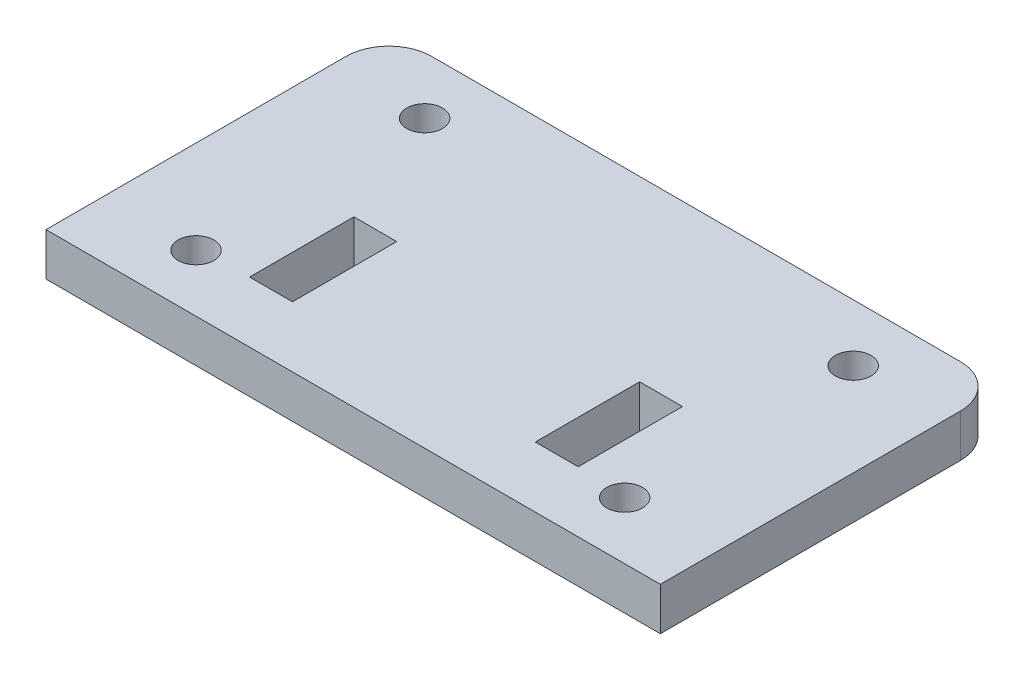
ISO-10303-21;
HEADER;
FILE_DESCRIPTION(('STEP AP214'),'2;1');
FILE_NAME('part.step','',(''),(''),'','','');
FILE_SCHEMA(('AUTOMOTIVE_DESIGN { 1 0 10303 214 1 1 1 1 }'));
ENDSEC;
DATA;
#1=APPLICATION_CONTEXT('core data for automotive mechanical design processes');
#2=APPLICATION_PROTOCOL_DEFINITION('international standard','automotive_design',2000,#1);
#3=PRODUCT_CONTEXT('',#1,'mechanical');
#4=PRODUCT('Part','Part','',(#3));
#5=PRODUCT_RELATED_PRODUCT_CATEGORY('part','',(#4));
#6=PRODUCT_DEFINITION_FORMATION('','',#4);
#7=PRODUCT_DEFINITION_CONTEXT('part definition',#1,'design');
#8=PRODUCT_DEFINITION('design','',#6,#7);
#9=PRODUCT_DEFINITION_SHAPE('','',#8);
#10=(LENGTH_UNIT() NAMED_UNIT(*) SI_UNIT(.MILLI.,.METRE.));
#11=(NAMED_UNIT(*) PLANE_ANGLE_UNIT() SI_UNIT($,.RADIAN.));
#12=(NAMED_UNIT(*) SI_UNIT($,.STERADIAN.) SOLID_ANGLE_UNIT());
#13=UNCERTAINTY_MEASURE_WITH_UNIT(LENGTH_MEASURE(1.E-05),#10,'distance_accuracy_value','');
#14=(GEOMETRIC_REPRESENTATION_CONTEXT(3) GLOBAL_UNCERTAINTY_ASSIGNED_CONTEXT((#13)) GLOBAL_UNIT_ASSIGNED_CONTEXT((#10,
#11,#12)) REPRESENTATION_CONTEXT('',''));
#15=CARTESIAN_POINT('',(0.,0.,0.));
#16=DIRECTION('',(0.,0.,1.));
#17=DIRECTION('',(1.,0.,0.));
#18=AXIS2_PLACEMENT_3D('',#15,#16,#17);
#19=CARTESIAN_POINT('',(-18.5,3.,-21.));
#20=DIRECTION('',(0.,1.,0.));
#21=DIRECTION('',(0.,0.,1.));
#22=AXIS2_PLACEMENT_3D('',#19,#20,#21);
#23=PLANE('',#22);
#24=CARTESIAN_POINT('',(15.,3.,-4.));
#25=DIRECTION('',(0.,1.,0.));
#26=DIRECTION('',(0.,0.,1.));
#27=AXIS2_PLACEMENT_3D('',#24,#25,#26);
#28=CIRCLE('',#27,1.25);
#29=CARTESIAN_POINT('',(15.,3.,-2.75));
#30=VERTEX_POINT('',#29);
#31=EDGE_CURVE('E346',#30,#30,#28,.T.);
#32=ORIENTED_EDGE('',*,*,#31,.F.);
#33=EDGE_LOOP('',(#32));
#34=FACE_BOUND('',#33,.T.);
#35=CARTESIAN_POINT('',(-15.,3.,-20.));
#36=DIRECTION('',(0.,1.,0.));
#37=DIRECTION('',(0.,0.,1.));
#38=AXIS2_PLACEMENT_3D('',#35,#36,#37);
#39=CIRCLE('',#38,1.25);
#40=CARTESIAN_POINT('',(-15.,3.,-18.75));
#41=VERTEX_POINT('',#40);
#42=EDGE_CURVE('E163',#41,#41,#39,.T.);
#43=ORIENTED_EDGE('',*,*,#42,.F.);
#44=EDGE_LOOP('',(#43));
#45=FACE_BOUND('',#44,.T.);
#46=DIRECTION('',(0.,0.,-1.));
#47=VECTOR('',#46,1.);
#48=CARTESIAN_POINT('',(21.5,3.,-21.));
#49=LINE('',#48,#47);
#50=CARTESIAN_POINT('',(21.5,3.,0.));
#51=VERTEX_POINT('',#50);
#52=CARTESIAN_POINT('',(21.5,3.,-21.));
#53=VERTEX_POINT('',#52);
#54=EDGE_CURVE('E204',#51,#53,#49,.T.);
#55=ORIENTED_EDGE('',*,*,#54,.T.);
#56=CARTESIAN_POINT('',(18.5,3.,-21.));
#57=DIRECTION('',(0.,1.,0.));
#58=DIRECTION('',(0.,0.,-1.));
#59=AXIS2_PLACEMENT_3D('',#56,#57,#58);
#60=CIRCLE('',#59,3.);
#61=CARTESIAN_POINT('',(18.5,3.,-24.));
#62=VERTEX_POINT('',#61);
#63=EDGE_CURVE('E207',#53,#62,#60,.T.);
#64=ORIENTED_EDGE('',*,*,#63,.T.);
#65=DIRECTION('',(-1.,0.,0.));
#66=VECTOR('',#65,1.);
#67=CARTESIAN_POINT('',(-18.5,3.,-24.));
#68=LINE('',#67,#66);
#69=CARTESIAN_POINT('',(-18.5,3.,-24.));
#70=VERTEX_POINT('',#69);
#71=EDGE_CURVE('E210',#62,#70,#68,.T.);
#72=ORIENTED_EDGE('',*,*,#71,.T.);
#73=CARTESIAN_POINT('',(-18.5,3.,-21.));
#74=DIRECTION('',(0.,1.,0.));
#75=DIRECTION('',(0.,0.,1.));
#76=AXIS2_PLACEMENT_3D('',#73,#74,#75);
#77=CIRCLE('',#76,3.);
#78=CARTESIAN_POINT('',(-21.5,3.,-21.));
#79=VERTEX_POINT('',#78);
#80=EDGE_CURVE('E212',#70,#79,#77,.T.);
#81=ORIENTED_EDGE('',*,*,#80,.T.);
#82=DIRECTION('',(0.,0.,1.));
#83=VECTOR('',#82,1.);
#84=CARTESIAN_POINT('',(-21.5,3.,-21.));
#85=LINE('',#84,#83);
#86=CARTESIAN_POINT('',(-21.5,3.,0.));
#87=VERTEX_POINT('',#86);
#88=EDGE_CURVE('E214',#79,#87,#85,.T.);
#89=ORIENTED_EDGE('',*,*,#88,.T.);
#90=DIRECTION('',(1.,0.,0.));
#91=VECTOR('',#90,1.);
#92=CARTESIAN_POINT('',(-21.5,3.,0.));
#93=LINE('',#92,#91);
#94=EDGE_CURVE('E216',#87,#51,#93,.T.);
#95=ORIENTED_EDGE('',*,*,#94,.T.);
#96=EDGE_LOOP('',(#55,#64,#72,#81,#89,#95));
#97=FACE_BOUND('',#96,.T.);
#98=DIRECTION('',(1.,0.,0.));
#99=VECTOR('',#98,1.);
#100=CARTESIAN_POINT('',(-11.5,3.,-4.25));
#101=LINE('',#100,#99);
#102=CARTESIAN_POINT('',(-11.5,3.,-4.25));
#103=VERTEX_POINT('',#102);
#104=CARTESIAN_POINT('',(-8.5,3.,-4.25));
#105=VERTEX_POINT('',#104);
#106=EDGE_CURVE('E175',#103,#105,#101,.T.);
#107=ORIENTED_EDGE('',*,*,#106,.F.);
#108=DIRECTION('',(0.,0.,1.));
#109=VECTOR('',#108,1.);
#110=CARTESIAN_POINT('',(-11.5,3.,-11.55));
#111=LINE('',#110,#109);
#112=CARTESIAN_POINT('',(-11.5,3.,-11.55));
#113=VERTEX_POINT('',#112);
#114=EDGE_CURVE('E173',#113,#103,#111,.T.);
#115=ORIENTED_EDGE('',*,*,#114,.F.);
#116=DIRECTION('',(-1.,0.,0.));
#117=VECTOR('',#116,1.);
#118=CARTESIAN_POINT('',(-11.5,3.,-11.55));
#119=LINE('',#118,#117);
#120=CARTESIAN_POINT('',(-8.5,3.,-11.55));
#121=VERTEX_POINT('',#120);
#122=EDGE_CURVE('E181',#121,#113,#119,.T.);
#123=ORIENTED_EDGE('',*,*,#122,.F.);
#124=DIRECTION('',(0.,0.,-1.));
#125=VECTOR('',#124,1.);
#126=CARTESIAN_POINT('',(-8.5,3.,-11.55));
#127=LINE('',#126,#125);
#128=EDGE_CURVE('E178',#105,#121,#127,.T.);
#129=ORIENTED_EDGE('',*,*,#128,.F.);
#130=EDGE_LOOP('',(#107,#115,#123,#129));
#131=FACE_BOUND('',#130,.T.);
#132=DIRECTION('',(-1.,0.,0.));
#133=VECTOR('',#132,1.);
#134=CARTESIAN_POINT('',(11.5,3.,-11.55));
#135=LINE('',#134,#133);
#136=CARTESIAN_POINT('',(11.5,3.,-11.55));
#137=VERTEX_POINT('',#136);
#138=CARTESIAN_POINT('',(8.5,3.,-11.55));
#139=VERTEX_POINT('',#138);
#140=EDGE_CURVE('E142',#137,#139,#135,.T.);
#141=ORIENTED_EDGE('',*,*,#140,.F.);
#142=DIRECTION('',(0.,0.,-1.));
#143=VECTOR('',#142,1.);
#144=CARTESIAN_POINT('',(11.5,3.,-11.55));
#145=LINE('',#144,#143);
#146=CARTESIAN_POINT('',(11.5,3.,-4.25));
#147=VERTEX_POINT('',#146);
#148=EDGE_CURVE('E134',#147,#137,#145,.T.);
#149=ORIENTED_EDGE('',*,*,#148,.F.);
#150=DIRECTION('',(1.,0.,0.));
#151=VECTOR('',#150,1.);
#152=CARTESIAN_POINT('',(11.5,3.,-4.25));
#153=LINE('',#152,#151);
#154=CARTESIAN_POINT('',(8.5,3.,-4.25));
#155=VERTEX_POINT('',#154);
#156=EDGE_CURVE('E157',#155,#147,#153,.T.);
#157=ORIENTED_EDGE('',*,*,#156,.F.);
#158=DIRECTION('',(0.,0.,1.));
#159=VECTOR('',#158,1.);
#160=CARTESIAN_POINT('',(8.5,3.,-11.55));
#161=LINE('',#160,#159);
#162=EDGE_CURVE('E155',#139,#155,#161,.T.);
#163=ORIENTED_EDGE('',*,*,#162,.F.);
#164=EDGE_LOOP('',(#141,#149,#157,#163));
#165=FACE_BOUND('',#164,.T.);
#166=CARTESIAN_POINT('',(15.,3.,-20.));
#167=DIRECTION('',(0.,1.,0.));
#168=DIRECTION('',(0.,0.,1.));
#169=AXIS2_PLACEMENT_3D('',#166,#167,#168);
#170=CIRCLE('',#169,1.25);
#171=CARTESIAN_POINT('',(15.,3.,-18.75));
#172=VERTEX_POINT('',#171);
#173=EDGE_CURVE('E352',#172,#172,#170,.T.);
#174=ORIENTED_EDGE('',*,*,#173,.F.);
#175=EDGE_LOOP('',(#174));
#176=FACE_BOUND('',#175,.T.);
#177=CARTESIAN_POINT('',(-15.,3.,-4.));
#178=DIRECTION('',(0.,1.,0.));
#179=DIRECTION('',(0.,0.,1.));
#180=AXIS2_PLACEMENT_3D('',#177,#178,#179);
#181=CIRCLE('',#180,1.25);
#182=CARTESIAN_POINT('',(-15.,3.,-2.75));
#183=VERTEX_POINT('',#182);
#184=EDGE_CURVE('E337',#183,#183,#181,.T.);
#185=ORIENTED_EDGE('',*,*,#184,.F.);
#186=EDGE_LOOP('',(#185));
#187=FACE_BOUND('',#186,.T.);
#188=ADVANCED_FACE('F33',(#34,#45,#97,#131,#165,#176,#187),#23,.T.);
#189=CARTESIAN_POINT('',(-18.5,0.,-21.));
#190=DIRECTION('',(0.,1.,0.));
#191=DIRECTION('',(0.,0.,1.));
#192=AXIS2_PLACEMENT_3D('',#189,#190,#191);
#193=PLANE('',#192);
#194=DIRECTION('',(0.,0.,1.));
#195=VECTOR('',#194,1.);
#196=CARTESIAN_POINT('',(-11.5,0.,-11.55));
#197=LINE('',#196,#195);
#198=CARTESIAN_POINT('',(-11.5,0.,-11.55));
#199=VERTEX_POINT('',#198);
#200=CARTESIAN_POINT('',(-11.5,0.,-4.25));
#201=VERTEX_POINT('',#200);
#202=EDGE_CURVE('E150',#199,#201,#197,.T.);
#203=ORIENTED_EDGE('',*,*,#202,.T.);
#204=DIRECTION('',(1.,0.,0.));
#205=VECTOR('',#204,1.);
#206=CARTESIAN_POINT('',(-11.5,0.,-4.25));
#207=LINE('',#206,#205);
#208=CARTESIAN_POINT('',(-8.5,0.,-4.25));
#209=VERTEX_POINT('',#208);
#210=EDGE_CURVE('E186',#201,#209,#207,.T.);
#211=ORIENTED_EDGE('',*,*,#210,.T.);
#212=DIRECTION('',(0.,0.,-1.));
#213=VECTOR('',#212,1.);
#214=CARTESIAN_POINT('',(-8.5,0.,-11.55));
#215=LINE('',#214,#213);
#216=CARTESIAN_POINT('',(-8.5,0.,-11.55));
#217=VERTEX_POINT('',#216);
#218=EDGE_CURVE('E189',#209,#217,#215,.T.);
#219=ORIENTED_EDGE('',*,*,#218,.T.);
#220=DIRECTION('',(-1.,0.,0.));
#221=VECTOR('',#220,1.);
#222=CARTESIAN_POINT('',(-11.5,0.,-11.55));
#223=LINE('',#222,#221);
#224=EDGE_CURVE('E176',#217,#199,#223,.T.);
#225=ORIENTED_EDGE('',*,*,#224,.T.);
#226=EDGE_LOOP('',(#203,#211,#219,#225));
#227=FACE_BOUND('',#226,.T.);
#228=DIRECTION('',(0.,0.,-1.));
#229=VECTOR('',#228,1.);
#230=CARTESIAN_POINT('',(21.5,0.,-21.));
#231=LINE('',#230,#229);
#232=CARTESIAN_POINT('',(21.5,0.,0.));
#233=VERTEX_POINT('',#232);
#234=CARTESIAN_POINT('',(21.5,0.,-21.));
#235=VERTEX_POINT('',#234);
#236=EDGE_CURVE('E203',#233,#235,#231,.T.);
#237=ORIENTED_EDGE('',*,*,#236,.F.);
#238=DIRECTION('',(1.,0.,0.));
#239=VECTOR('',#238,1.);
#240=CARTESIAN_POINT('',(-21.5,0.,0.));
#241=LINE('',#240,#239);
#242=CARTESIAN_POINT('',(-21.5,0.,0.));
#243=VERTEX_POINT('',#242);
#244=EDGE_CURVE('E208',#243,#233,#241,.T.);
#245=ORIENTED_EDGE('',*,*,#244,.F.);
#246=DIRECTION('',(0.,0.,1.));
#247=VECTOR('',#246,1.);
#248=CARTESIAN_POINT('',(-21.5,0.,-21.));
#249=LINE('',#248,#247);
#250=CARTESIAN_POINT('',(-21.5,0.,-21.));
#251=VERTEX_POINT('',#250);
#252=EDGE_CURVE('E227',#251,#243,#249,.T.);
#253=ORIENTED_EDGE('',*,*,#252,.F.);
#254=CARTESIAN_POINT('',(-18.5,0.,-21.));
#255=DIRECTION('',(0.,1.,0.));
#256=DIRECTION('',(0.,0.,1.));
#257=AXIS2_PLACEMENT_3D('',#254,#255,#256);
#258=CIRCLE('',#257,3.);
#259=CARTESIAN_POINT('',(-18.5,0.,-24.));
#260=VERTEX_POINT('',#259);
#261=EDGE_CURVE('E225',#260,#251,#258,.T.);
#262=ORIENTED_EDGE('',*,*,#261,.F.);
#263=DIRECTION('',(-1.,0.,0.));
#264=VECTOR('',#263,1.);
#265=CARTESIAN_POINT('',(-18.5,0.,-24.));
#266=LINE('',#265,#264);
#267=CARTESIAN_POINT('',(18.5,0.,-24.));
#268=VERTEX_POINT('',#267);
#269=EDGE_CURVE('E223',#268,#260,#266,.T.);
#270=ORIENTED_EDGE('',*,*,#269,.F.);
#271=CARTESIAN_POINT('',(18.5,0.,-21.));
#272=DIRECTION('',(0.,1.,0.));
#273=DIRECTION('',(0.,0.,-1.));
#274=AXIS2_PLACEMENT_3D('',#271,#272,#273);
#275=CIRCLE('',#274,3.);
#276=EDGE_CURVE('E221',#235,#268,#275,.T.);
#277=ORIENTED_EDGE('',*,*,#276,.F.);
#278=EDGE_LOOP('',(#237,#245,#253,#262,#270,#277));
#279=FACE_BOUND('',#278,.T.);
#280=DIRECTION('',(0.,0.,-1.));
#281=VECTOR('',#280,1.);
#282=CARTESIAN_POINT('',(11.5,0.,-11.55));
#283=LINE('',#282,#281);
#284=CARTESIAN_POINT('',(11.5,0.,-4.25));
#285=VERTEX_POINT('',#284);
#286=CARTESIAN_POINT('',(11.5,0.,-11.55));
#287=VERTEX_POINT('',#286);
#288=EDGE_CURVE('E56',#285,#287,#283,.T.);
#289=ORIENTED_EDGE('',*,*,#288,.T.);
#290=DIRECTION('',(-1.,0.,0.));
#291=VECTOR('',#290,1.);
#292=CARTESIAN_POINT('',(11.5,0.,-11.55));
#293=LINE('',#292,#291);
#294=CARTESIAN_POINT('',(8.5,0.,-11.55));
#295=VERTEX_POINT('',#294);
#296=EDGE_CURVE('E149',#287,#295,#293,.T.);
#297=ORIENTED_EDGE('',*,*,#296,.T.);
#298=DIRECTION('',(0.,0.,1.));
#299=VECTOR('',#298,1.);
#300=CARTESIAN_POINT('',(8.5,0.,-11.55));
#301=LINE('',#300,#299);
#302=CARTESIAN_POINT('',(8.5,0.,-4.25));
#303=VERTEX_POINT('',#302);
#304=EDGE_CURVE('E165',#295,#303,#301,.T.);
#305=ORIENTED_EDGE('',*,*,#304,.T.);
#306=DIRECTION('',(1.,0.,0.));
#307=VECTOR('',#306,1.);
#308=CARTESIAN_POINT('',(11.5,0.,-4.25));
#309=LINE('',#308,#307);
#310=EDGE_CURVE('E143',#303,#285,#309,.T.);
#311=ORIENTED_EDGE('',*,*,#310,.T.);
#312=EDGE_LOOP('',(#289,#297,#305,#311));
#313=FACE_BOUND('',#312,.T.);
#314=CARTESIAN_POINT('',(-15.,0.,-20.));
#315=DIRECTION('',(0.,1.,0.));
#316=DIRECTION('',(0.,0.,1.));
#317=AXIS2_PLACEMENT_3D('',#314,#315,#316);
#318=CIRCLE('',#317,1.25);
#319=CARTESIAN_POINT('',(-15.,0.,-18.75));
#320=VERTEX_POINT('',#319);
#321=EDGE_CURVE('E355',#320,#320,#318,.T.);
#322=ORIENTED_EDGE('',*,*,#321,.T.);
#323=EDGE_LOOP('',(#322));
#324=FACE_BOUND('',#323,.T.);
#325=CARTESIAN_POINT('',(15.,0.,-20.));
#326=DIRECTION('',(0.,1.,0.));
#327=DIRECTION('',(0.,0.,1.));
#328=AXIS2_PLACEMENT_3D('',#325,#326,#327);
#329=CIRCLE('',#328,1.25);
#330=CARTESIAN_POINT('',(15.,0.,-18.75));
#331=VERTEX_POINT('',#330);
#332=EDGE_CURVE('E349',#331,#331,#329,.T.);
#333=ORIENTED_EDGE('',*,*,#332,.T.);
#334=EDGE_LOOP('',(#333));
#335=FACE_BOUND('',#334,.T.);
#336=CARTESIAN_POINT('',(15.,0.,-4.));
#337=DIRECTION('',(0.,1.,0.));
#338=DIRECTION('',(0.,0.,1.));
#339=AXIS2_PLACEMENT_3D('',#336,#337,#338);
#340=CIRCLE('',#339,1.25);
#341=CARTESIAN_POINT('',(15.,0.,-2.75));
#342=VERTEX_POINT('',#341);
#343=EDGE_CURVE('E343',#342,#342,#340,.T.);
#344=ORIENTED_EDGE('',*,*,#343,.T.);
#345=EDGE_LOOP('',(#344));
#346=FACE_BOUND('',#345,.T.);
#347=CARTESIAN_POINT('',(-15.,0.,-4.));
#348=DIRECTION('',(0.,1.,0.));
#349=DIRECTION('',(0.,0.,1.));
#350=AXIS2_PLACEMENT_3D('',#347,#348,#349);
#351=CIRCLE('',#350,1.25);
#352=CARTESIAN_POINT('',(-15.,0.,-2.75));
#353=VERTEX_POINT('',#352);
#354=EDGE_CURVE('E340',#353,#353,#351,.T.);
#355=ORIENTED_EDGE('',*,*,#354,.T.);
#356=EDGE_LOOP('',(#355));
#357=FACE_BOUND('',#356,.T.);
#358=ADVANCED_FACE('F251',(#227,#279,#313,#324,#335,#346,#357),#193,.F.);
#359=CARTESIAN_POINT('',(21.5,3.,-21.));
#360=DIRECTION('',(-1.,0.,0.));
#361=DIRECTION('',(0.,0.,1.));
#362=AXIS2_PLACEMENT_3D('',#359,#360,#361);
#363=PLANE('',#362);
#364=ORIENTED_EDGE('',*,*,#236,.T.);
#365=DIRECTION('',(0.,-1.,0.));
#366=VECTOR('',#365,1.);
#367=CARTESIAN_POINT('',(21.5,3.,-21.));
#368=LINE('',#367,#366);
#369=EDGE_CURVE('E11',#53,#235,#368,.T.);
#370=ORIENTED_EDGE('',*,*,#369,.F.);
#371=ORIENTED_EDGE('',*,*,#54,.F.);
#372=DIRECTION('',(0.,-1.,0.));
#373=VECTOR('',#372,1.);
#374=CARTESIAN_POINT('',(21.5,3.,0.));
#375=LINE('',#374,#373);
#376=EDGE_CURVE('E218',#51,#233,#375,.T.);
#377=ORIENTED_EDGE('',*,*,#376,.T.);
#378=EDGE_LOOP('',(#364,#370,#371,#377));
#379=FACE_BOUND('',#378,.T.);
#380=ADVANCED_FACE('F35',(#379),#363,.F.);
#381=CARTESIAN_POINT('',(18.5,3.,-21.));
#382=DIRECTION('',(0.,-1.,0.));
#383=DIRECTION('',(0.,0.,-1.));
#384=AXIS2_PLACEMENT_3D('',#381,#382,#383);
#385=CYLINDRICAL_SURFACE('',#384,3.);
#386=ORIENTED_EDGE('',*,*,#276,.T.);
#387=DIRECTION('',(0.,-1.,0.));
#388=VECTOR('',#387,1.);
#389=CARTESIAN_POINT('',(18.5,3.,-24.));
#390=LINE('',#389,#388);
#391=EDGE_CURVE('E41',#62,#268,#390,.T.);
#392=ORIENTED_EDGE('',*,*,#391,.F.);
#393=ORIENTED_EDGE('',*,*,#63,.F.);
#394=ORIENTED_EDGE('',*,*,#369,.T.);
#395=EDGE_LOOP('',(#386,#392,#393,#394));
#396=FACE_BOUND('',#395,.T.);
#397=ADVANCED_FACE('F269',(#396),#385,.T.);
#398=CARTESIAN_POINT('',(-18.5,3.,-24.));
#399=DIRECTION('',(0.,0.,1.));
#400=DIRECTION('',(1.,0.,0.));
#401=AXIS2_PLACEMENT_3D('',#398,#399,#400);
#402=PLANE('',#401);
#403=ORIENTED_EDGE('',*,*,#269,.T.);
#404=DIRECTION('',(0.,-1.,0.));
#405=VECTOR('',#404,1.);
#406=CARTESIAN_POINT('',(-18.5,3.,-24.));
#407=LINE('',#406,#405);
#408=EDGE_CURVE('E238',#70,#260,#407,.T.);
#409=ORIENTED_EDGE('',*,*,#408,.F.);
#410=ORIENTED_EDGE('',*,*,#71,.F.);
#411=ORIENTED_EDGE('',*,*,#391,.T.);
#412=EDGE_LOOP('',(#403,#409,#410,#411));
#413=FACE_BOUND('',#412,.T.);
#414=ADVANCED_FACE('F245',(#413),#402,.F.);
#415=CARTESIAN_POINT('',(-18.5,3.,-21.));
#416=DIRECTION('',(0.,-1.,0.));
#417=DIRECTION('',(0.,0.,-1.));
#418=AXIS2_PLACEMENT_3D('',#415,#416,#417);
#419=CYLINDRICAL_SURFACE('',#418,3.);
#420=ORIENTED_EDGE('',*,*,#261,.T.);
#421=DIRECTION('',(0.,-1.,0.));
#422=VECTOR('',#421,1.);
#423=CARTESIAN_POINT('',(-21.5,3.,-21.));
#424=LINE('',#423,#422);
#425=EDGE_CURVE('E235',#79,#251,#424,.T.);
#426=ORIENTED_EDGE('',*,*,#425,.F.);
#427=ORIENTED_EDGE('',*,*,#80,.F.);
#428=ORIENTED_EDGE('',*,*,#408,.T.);
#429=EDGE_LOOP('',(#420,#426,#427,#428));
#430=FACE_BOUND('',#429,.T.);
#431=ADVANCED_FACE('F257',(#430),#419,.T.);
#432=CARTESIAN_POINT('',(-21.5,3.,-21.));
#433=DIRECTION('',(1.,0.,0.));
#434=DIRECTION('',(0.,0.,-1.));
#435=AXIS2_PLACEMENT_3D('',#432,#433,#434);
#436=PLANE('',#435);
#437=ORIENTED_EDGE('',*,*,#252,.T.);
#438=DIRECTION('',(0.,-1.,0.));
#439=VECTOR('',#438,1.);
#440=CARTESIAN_POINT('',(-21.5,3.,0.));
#441=LINE('',#440,#439);
#442=EDGE_CURVE('E232',#87,#243,#441,.T.);
#443=ORIENTED_EDGE('',*,*,#442,.F.);
#444=ORIENTED_EDGE('',*,*,#88,.F.);
#445=ORIENTED_EDGE('',*,*,#425,.T.);
#446=EDGE_LOOP('',(#437,#443,#444,#445));
#447=FACE_BOUND('',#446,.T.);
#448=ADVANCED_FACE('F261',(#447),#436,.F.);
#449=CARTESIAN_POINT('',(-21.5,3.,0.));
#450=DIRECTION('',(0.,0.,-1.));
#451=DIRECTION('',(-1.,0.,0.));
#452=AXIS2_PLACEMENT_3D('',#449,#450,#451);
#453=PLANE('',#452);
#454=ORIENTED_EDGE('',*,*,#244,.T.);
#455=ORIENTED_EDGE('',*,*,#376,.F.);
#456=ORIENTED_EDGE('',*,*,#94,.F.);
#457=ORIENTED_EDGE('',*,*,#442,.T.);
#458=EDGE_LOOP('',(#454,#455,#456,#457));
#459=FACE_BOUND('',#458,.T.);
#460=ADVANCED_FACE('F272',(#459),#453,.F.);
#461=CARTESIAN_POINT('',(-11.5,3.,-11.55));
#462=DIRECTION('',(1.,0.,0.));
#463=DIRECTION('',(0.,0.,-1.));
#464=AXIS2_PLACEMENT_3D('',#461,#462,#463);
#465=PLANE('',#464);
#466=ORIENTED_EDGE('',*,*,#202,.F.);
#467=DIRECTION('',(0.,-1.,0.));
#468=VECTOR('',#467,1.);
#469=CARTESIAN_POINT('',(-11.5,3.,-11.55));
#470=LINE('',#469,#468);
#471=EDGE_CURVE('E183',#113,#199,#470,.T.);
#472=ORIENTED_EDGE('',*,*,#471,.F.);
#473=ORIENTED_EDGE('',*,*,#114,.T.);
#474=DIRECTION('',(0.,-1.,0.));
#475=VECTOR('',#474,1.);
#476=CARTESIAN_POINT('',(-11.5,3.,-4.25));
#477=LINE('',#476,#475);
#478=EDGE_CURVE('E200',#103,#201,#477,.T.);
#479=ORIENTED_EDGE('',*,*,#478,.T.);
#480=EDGE_LOOP('',(#466,#472,#473,#479));
#481=FACE_BOUND('',#480,.T.);
#482=ADVANCED_FACE('F274',(#481),#465,.T.);
#483=CARTESIAN_POINT('',(-11.5,3.,-4.25));
#484=DIRECTION('',(0.,0.,-1.));
#485=DIRECTION('',(-1.,0.,0.));
#486=AXIS2_PLACEMENT_3D('',#483,#484,#485);
#487=PLANE('',#486);
#488=ORIENTED_EDGE('',*,*,#210,.F.);
#489=ORIENTED_EDGE('',*,*,#478,.F.);
#490=ORIENTED_EDGE('',*,*,#106,.T.);
#491=DIRECTION('',(0.,-1.,0.));
#492=VECTOR('',#491,1.);
#493=CARTESIAN_POINT('',(-8.5,3.,-4.25));
#494=LINE('',#493,#492);
#495=EDGE_CURVE('E198',#105,#209,#494,.T.);
#496=ORIENTED_EDGE('',*,*,#495,.T.);
#497=EDGE_LOOP('',(#488,#489,#490,#496));
#498=FACE_BOUND('',#497,.T.);
#499=ADVANCED_FACE('F280',(#498),#487,.T.);
#500=CARTESIAN_POINT('',(-8.5,3.,-11.55));
#501=DIRECTION('',(-1.,0.,0.));
#502=DIRECTION('',(0.,0.,1.));
#503=AXIS2_PLACEMENT_3D('',#500,#501,#502);
#504=PLANE('',#503);
#505=ORIENTED_EDGE('',*,*,#218,.F.);
#506=ORIENTED_EDGE('',*,*,#495,.F.);
#507=ORIENTED_EDGE('',*,*,#128,.T.);
#508=DIRECTION('',(0.,-1.,0.));
#509=VECTOR('',#508,1.);
#510=CARTESIAN_POINT('',(-8.5,3.,-11.55));
#511=LINE('',#510,#509);
#512=EDGE_CURVE('E196',#121,#217,#511,.T.);
#513=ORIENTED_EDGE('',*,*,#512,.T.);
#514=EDGE_LOOP('',(#505,#506,#507,#513));
#515=FACE_BOUND('',#514,.T.);
#516=ADVANCED_FACE('F297',(#515),#504,.T.);
#517=CARTESIAN_POINT('',(-11.5,3.,-11.55));
#518=DIRECTION('',(0.,0.,1.));
#519=DIRECTION('',(1.,0.,0.));
#520=AXIS2_PLACEMENT_3D('',#517,#518,#519);
#521=PLANE('',#520);
#522=ORIENTED_EDGE('',*,*,#224,.F.);
#523=ORIENTED_EDGE('',*,*,#512,.F.);
#524=ORIENTED_EDGE('',*,*,#122,.T.);
#525=ORIENTED_EDGE('',*,*,#471,.T.);
#526=EDGE_LOOP('',(#522,#523,#524,#525));
#527=FACE_BOUND('',#526,.T.);
#528=ADVANCED_FACE('F301',(#527),#521,.T.);
#529=CARTESIAN_POINT('',(11.5,3.,-11.55));
#530=DIRECTION('',(-1.,0.,0.));
#531=DIRECTION('',(0.,0.,1.));
#532=AXIS2_PLACEMENT_3D('',#529,#530,#531);
#533=PLANE('',#532);
#534=ORIENTED_EDGE('',*,*,#288,.F.);
#535=DIRECTION('',(0.,-1.,0.));
#536=VECTOR('',#535,1.);
#537=CARTESIAN_POINT('',(11.5,3.,-4.25));
#538=LINE('',#537,#536);
#539=EDGE_CURVE('E138',#147,#285,#538,.T.);
#540=ORIENTED_EDGE('',*,*,#539,.F.);
#541=ORIENTED_EDGE('',*,*,#148,.T.);
#542=DIRECTION('',(0.,-1.,0.));
#543=VECTOR('',#542,1.);
#544=CARTESIAN_POINT('',(11.5,3.,-11.55));
#545=LINE('',#544,#543);
#546=EDGE_CURVE('E137',#137,#287,#545,.T.);
#547=ORIENTED_EDGE('',*,*,#546,.T.);
#548=EDGE_LOOP('',(#534,#540,#541,#547));
#549=FACE_BOUND('',#548,.T.);
#550=ADVANCED_FACE('F136',(#549),#533,.T.);
#551=CARTESIAN_POINT('',(11.5,3.,-11.55));
#552=DIRECTION('',(0.,0.,1.));
#553=DIRECTION('',(1.,0.,0.));
#554=AXIS2_PLACEMENT_3D('',#551,#552,#553);
#555=PLANE('',#554);
#556=ORIENTED_EDGE('',*,*,#296,.F.);
#557=ORIENTED_EDGE('',*,*,#546,.F.);
#558=ORIENTED_EDGE('',*,*,#140,.T.);
#559=DIRECTION('',(0.,-1.,0.));
#560=VECTOR('',#559,1.);
#561=CARTESIAN_POINT('',(8.5,3.,-11.55));
#562=LINE('',#561,#560);
#563=EDGE_CURVE('E151',#139,#295,#562,.T.);
#564=ORIENTED_EDGE('',*,*,#563,.T.);
#565=EDGE_LOOP('',(#556,#557,#558,#564));
#566=FACE_BOUND('',#565,.T.);
#567=ADVANCED_FACE('F146',(#566),#555,.T.);
#568=CARTESIAN_POINT('',(8.5,3.,-11.55));
#569=DIRECTION('',(1.,0.,0.));
#570=DIRECTION('',(0.,0.,-1.));
#571=AXIS2_PLACEMENT_3D('',#568,#569,#570);
#572=PLANE('',#571);
#573=ORIENTED_EDGE('',*,*,#304,.F.);
#574=ORIENTED_EDGE('',*,*,#563,.F.);
#575=ORIENTED_EDGE('',*,*,#162,.T.);
#576=DIRECTION('',(0.,-1.,0.));
#577=VECTOR('',#576,1.);
#578=CARTESIAN_POINT('',(8.5,3.,-4.25));
#579=LINE('',#578,#577);
#580=EDGE_CURVE('E48',#155,#303,#579,.T.);
#581=ORIENTED_EDGE('',*,*,#580,.T.);
#582=EDGE_LOOP('',(#573,#574,#575,#581));
#583=FACE_BOUND('',#582,.T.);
#584=ADVANCED_FACE('F310',(#583),#572,.T.);
#585=CARTESIAN_POINT('',(11.5,3.,-4.25));
#586=DIRECTION('',(0.,0.,-1.));
#587=DIRECTION('',(-1.,0.,0.));
#588=AXIS2_PLACEMENT_3D('',#585,#586,#587);
#589=PLANE('',#588);
#590=ORIENTED_EDGE('',*,*,#310,.F.);
#591=ORIENTED_EDGE('',*,*,#580,.F.);
#592=ORIENTED_EDGE('',*,*,#156,.T.);
#593=ORIENTED_EDGE('',*,*,#539,.T.);
#594=EDGE_LOOP('',(#590,#591,#592,#593));
#595=FACE_BOUND('',#594,.T.);
#596=ADVANCED_FACE('F313',(#595),#589,.T.);
#597=CARTESIAN_POINT('',(-15.,3.,-20.));
#598=DIRECTION('',(0.,-1.,0.));
#599=DIRECTION('',(0.,0.,-1.));
#600=AXIS2_PLACEMENT_3D('',#597,#598,#599);
#601=CYLINDRICAL_SURFACE('',#600,1.25);
#602=ORIENTED_EDGE('',*,*,#42,.T.);
#603=EDGE_LOOP('',(#602));
#604=FACE_BOUND('',#603,.T.);
#605=ORIENTED_EDGE('',*,*,#321,.F.);
#606=EDGE_LOOP('',(#605));
#607=FACE_BOUND('',#606,.T.);
#608=ADVANCED_FACE('F317',(#604,#607),#601,.F.);
#609=CARTESIAN_POINT('',(15.,3.,-20.));
#610=DIRECTION('',(0.,-1.,0.));
#611=DIRECTION('',(0.,0.,-1.));
#612=AXIS2_PLACEMENT_3D('',#609,#610,#611);
#613=CYLINDRICAL_SURFACE('',#612,1.25);
#614=ORIENTED_EDGE('',*,*,#173,.T.);
#615=EDGE_LOOP('',(#614));
#616=FACE_BOUND('',#615,.T.);
#617=ORIENTED_EDGE('',*,*,#332,.F.);
#618=EDGE_LOOP('',(#617));
#619=FACE_BOUND('',#618,.T.);
#620=ADVANCED_FACE('F320',(#616,#619),#613,.F.);
#621=CARTESIAN_POINT('',(15.,3.,-4.));
#622=DIRECTION('',(0.,-1.,0.));
#623=DIRECTION('',(0.,0.,-1.));
#624=AXIS2_PLACEMENT_3D('',#621,#622,#623);
#625=CYLINDRICAL_SURFACE('',#624,1.25);
#626=ORIENTED_EDGE('',*,*,#31,.T.);
#627=EDGE_LOOP('',(#626));
#628=FACE_BOUND('',#627,.T.);
#629=ORIENTED_EDGE('',*,*,#343,.F.);
#630=EDGE_LOOP('',(#629));
#631=FACE_BOUND('',#630,.T.);
#632=ADVANCED_FACE('F324',(#628,#631),#625,.F.);
#633=CARTESIAN_POINT('',(-15.,3.,-4.));
#634=DIRECTION('',(0.,-1.,0.));
#635=DIRECTION('',(0.,0.,-1.));
#636=AXIS2_PLACEMENT_3D('',#633,#634,#635);
#637=CYLINDRICAL_SURFACE('',#636,1.25);
#638=ORIENTED_EDGE('',*,*,#184,.T.);
#639=EDGE_LOOP('',(#638));
#640=FACE_BOUND('',#639,.T.);
#641=ORIENTED_EDGE('',*,*,#354,.F.);
#642=EDGE_LOOP('',(#641));
#643=FACE_BOUND('',#642,.T.);
#644=ADVANCED_FACE('F328',(#640,#643),#637,.F.);
#645=CLOSED_SHELL('',(#188,#358,#380,#397,#414,#431,#448,#460,#482,#499,#516,#528,#550,#567,
#584,#596,#608,#620,#632,#644));
#646=MANIFOLD_SOLID_BREP('B2',#645);
#647=ADVANCED_BREP_SHAPE_REPRESENTATION('',(#18,#646),#14);
#648=SHAPE_DEFINITION_REPRESENTATION(#9,#647);
ENDSEC;
END-ISO-10303-21;
